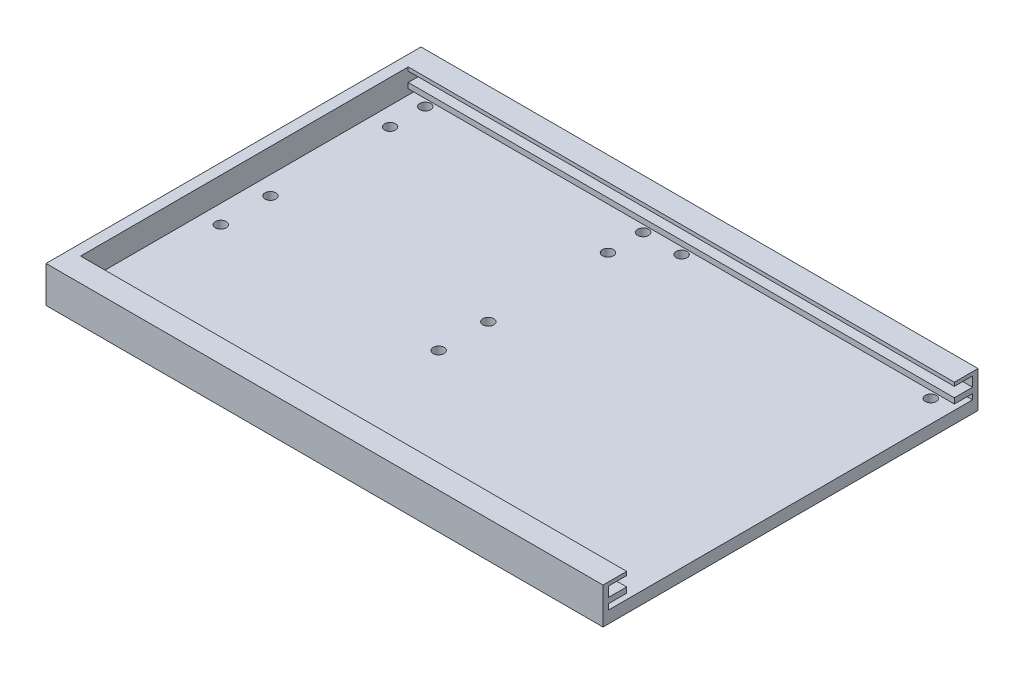
ISO-10303-21;
HEADER;
FILE_DESCRIPTION(('STEP AP214'),'2;1');
FILE_NAME('part.step','',(''),(''),'','','');
FILE_SCHEMA(('AUTOMOTIVE_DESIGN { 1 0 10303 214 1 1 1 1 }'));
ENDSEC;
DATA;
#1=APPLICATION_CONTEXT('core data for automotive mechanical design processes');
#2=APPLICATION_PROTOCOL_DEFINITION('international standard','automotive_design',2000,#1);
#3=PRODUCT_CONTEXT('',#1,'mechanical');
#4=PRODUCT('Part','Part','',(#3));
#5=PRODUCT_RELATED_PRODUCT_CATEGORY('part','',(#4));
#6=PRODUCT_DEFINITION_FORMATION('','',#4);
#7=PRODUCT_DEFINITION_CONTEXT('part definition',#1,'design');
#8=PRODUCT_DEFINITION('design','',#6,#7);
#9=PRODUCT_DEFINITION_SHAPE('','',#8);
#10=(LENGTH_UNIT() NAMED_UNIT(*) SI_UNIT(.MILLI.,.METRE.));
#11=(NAMED_UNIT(*) PLANE_ANGLE_UNIT() SI_UNIT($,.RADIAN.));
#12=(NAMED_UNIT(*) SI_UNIT($,.STERADIAN.) SOLID_ANGLE_UNIT());
#13=UNCERTAINTY_MEASURE_WITH_UNIT(LENGTH_MEASURE(1.E-05),#10,'distance_accuracy_value','');
#14=(GEOMETRIC_REPRESENTATION_CONTEXT(3) GLOBAL_UNCERTAINTY_ASSIGNED_CONTEXT((#13)) GLOBAL_UNIT_ASSIGNED_CONTEXT((#10,
#11,#12)) REPRESENTATION_CONTEXT('',''));
#15=CARTESIAN_POINT('',(0.,0.,0.));
#16=DIRECTION('',(0.,0.,1.));
#17=DIRECTION('',(1.,0.,0.));
#18=AXIS2_PLACEMENT_3D('',#15,#16,#17);
#19=CARTESIAN_POINT('',(3.,1.30000000000001,50.));
#20=DIRECTION('',(0.,-1.,0.));
#21=DIRECTION('',(0.,0.,-1.));
#22=AXIS2_PLACEMENT_3D('',#19,#20,#21);
#23=PLANE('',#22);
#24=DIRECTION('',(0.,0.,-1.));
#25=VECTOR('',#24,1.);
#26=CARTESIAN_POINT('',(3.,1.30000000000001,50.));
#27=LINE('',#26,#25);
#28=CARTESIAN_POINT('',(3.,1.30000000000001,-45.));
#29=VERTEX_POINT('',#28);
#30=CARTESIAN_POINT('',(3.,1.30000000000001,-50.));
#31=VERTEX_POINT('',#30);
#32=EDGE_CURVE('E247',#29,#31,#27,.T.);
#33=ORIENTED_EDGE('',*,*,#32,.F.);
#34=DIRECTION('',(1.,0.,0.));
#35=VECTOR('',#34,1.);
#36=CARTESIAN_POINT('',(3.,1.30000000000002,-45.));
#37=LINE('',#36,#35);
#38=CARTESIAN_POINT('',(153.,1.30000000000002,-45.));
#39=VERTEX_POINT('',#38);
#40=EDGE_CURVE('E231',#29,#39,#37,.T.);
#41=ORIENTED_EDGE('',*,*,#40,.T.);
#42=DIRECTION('',(0.,0.,-1.));
#43=VECTOR('',#42,1.);
#44=CARTESIAN_POINT('',(153.,1.30000000000001,50.));
#45=LINE('',#44,#43);
#46=CARTESIAN_POINT('',(153.,1.30000000000001,-50.));
#47=VERTEX_POINT('',#46);
#48=EDGE_CURVE('E259',#39,#47,#45,.T.);
#49=ORIENTED_EDGE('',*,*,#48,.T.);
#50=DIRECTION('',(1.,0.,0.));
#51=VECTOR('',#50,1.);
#52=CARTESIAN_POINT('',(3.,1.30000000000001,-50.));
#53=LINE('',#52,#51);
#54=EDGE_CURVE('E269',#31,#47,#53,.T.);
#55=ORIENTED_EDGE('',*,*,#54,.F.);
#56=EDGE_LOOP('',(#33,#41,#49,#55));
#57=FACE_BOUND('',#56,.T.);
#58=ADVANCED_FACE('F35',(#57),#23,.F.);
#59=CARTESIAN_POINT('',(153.,5.,-51.5));
#60=DIRECTION('',(0.,0.,1.));
#61=DIRECTION('',(1.,0.,0.));
#62=AXIS2_PLACEMENT_3D('',#59,#60,#61);
#63=PLANE('',#62);
#64=DIRECTION('',(0.,1.,0.));
#65=VECTOR('',#64,1.);
#66=CARTESIAN_POINT('',(0.,5.,-51.5));
#67=LINE('',#66,#65);
#68=CARTESIAN_POINT('',(0.,-5.,-51.5));
#69=VERTEX_POINT('',#68);
#70=CARTESIAN_POINT('',(0.,5.,-51.5));
#71=VERTEX_POINT('',#70);
#72=EDGE_CURVE('E290',#69,#71,#67,.T.);
#73=ORIENTED_EDGE('',*,*,#72,.T.);
#74=DIRECTION('',(-1.,0.,0.));
#75=VECTOR('',#74,1.);
#76=CARTESIAN_POINT('',(153.,5.,-51.5));
#77=LINE('',#76,#75);
#78=CARTESIAN_POINT('',(153.,5.,-51.5));
#79=VERTEX_POINT('',#78);
#80=EDGE_CURVE('E11',#79,#71,#77,.T.);
#81=ORIENTED_EDGE('',*,*,#80,.F.);
#82=DIRECTION('',(0.,1.,0.));
#83=VECTOR('',#82,1.);
#84=CARTESIAN_POINT('',(153.,5.,-51.5));
#85=LINE('',#84,#83);
#86=CARTESIAN_POINT('',(153.,-5.,-51.5));
#87=VERTEX_POINT('',#86);
#88=EDGE_CURVE('E297',#87,#79,#85,.T.);
#89=ORIENTED_EDGE('',*,*,#88,.F.);
#90=DIRECTION('',(-1.,0.,0.));
#91=VECTOR('',#90,1.);
#92=CARTESIAN_POINT('',(153.,-5.,-51.5));
#93=LINE('',#92,#91);
#94=EDGE_CURVE('E309',#87,#69,#93,.T.);
#95=ORIENTED_EDGE('',*,*,#94,.T.);
#96=EDGE_LOOP('',(#73,#81,#89,#95));
#97=FACE_BOUND('',#96,.T.);
#98=ADVANCED_FACE('F37',(#97),#63,.F.);
#99=CARTESIAN_POINT('',(153.,5.,51.5));
#100=DIRECTION('',(0.,-1.,0.));
#101=DIRECTION('',(0.,0.,-1.));
#102=AXIS2_PLACEMENT_3D('',#99,#100,#101);
#103=PLANE('',#102);
#104=DIRECTION('',(0.,0.,1.));
#105=VECTOR('',#104,1.);
#106=CARTESIAN_POINT('',(3.,5.00000000000002,-45.));
#107=LINE('',#106,#105);
#108=CARTESIAN_POINT('',(3.,5.00000000000002,-45.));
#109=VERTEX_POINT('',#108);
#110=CARTESIAN_POINT('',(3.,5.,45.));
#111=VERTEX_POINT('',#110);
#112=EDGE_CURVE('E276',#109,#111,#107,.T.);
#113=ORIENTED_EDGE('',*,*,#112,.F.);
#114=DIRECTION('',(1.,0.,0.));
#115=VECTOR('',#114,1.);
#116=CARTESIAN_POINT('',(3.,5.00000000000002,-45.));
#117=LINE('',#116,#115);
#118=CARTESIAN_POINT('',(153.,5.00000000000002,-45.));
#119=VERTEX_POINT('',#118);
#120=EDGE_CURVE('E287',#109,#119,#117,.T.);
#121=ORIENTED_EDGE('',*,*,#120,.T.);
#122=DIRECTION('',(0.,0.,1.));
#123=VECTOR('',#122,1.);
#124=CARTESIAN_POINT('',(153.,5.,51.5));
#125=LINE('',#124,#123);
#126=EDGE_CURVE('E302',#79,#119,#125,.T.);
#127=ORIENTED_EDGE('',*,*,#126,.F.);
#128=ORIENTED_EDGE('',*,*,#80,.T.);
#129=DIRECTION('',(0.,0.,1.));
#130=VECTOR('',#129,1.);
#131=CARTESIAN_POINT('',(0.,5.,51.5));
#132=LINE('',#131,#130);
#133=CARTESIAN_POINT('',(0.,5.,51.5));
#134=VERTEX_POINT('',#133);
#135=EDGE_CURVE('E312',#71,#134,#132,.T.);
#136=ORIENTED_EDGE('',*,*,#135,.T.);
#137=DIRECTION('',(-1.,0.,0.));
#138=VECTOR('',#137,1.);
#139=CARTESIAN_POINT('',(153.,5.,51.5));
#140=LINE('',#139,#138);
#141=CARTESIAN_POINT('',(153.,5.,51.5));
#142=VERTEX_POINT('',#141);
#143=EDGE_CURVE('E44',#142,#134,#140,.T.);
#144=ORIENTED_EDGE('',*,*,#143,.F.);
#145=CARTESIAN_POINT('',(153.,5.,45.));
#146=VERTEX_POINT('',#145);
#147=EDGE_CURVE('E300',#146,#142,#125,.T.);
#148=ORIENTED_EDGE('',*,*,#147,.F.);
#149=DIRECTION('',(1.,0.,0.));
#150=VECTOR('',#149,1.);
#151=CARTESIAN_POINT('',(3.,5.,45.));
#152=LINE('',#151,#150);
#153=EDGE_CURVE('E60',#111,#146,#152,.T.);
#154=ORIENTED_EDGE('',*,*,#153,.F.);
#155=EDGE_LOOP('',(#113,#121,#127,#128,#136,#144,#148,#154));
#156=FACE_BOUND('',#155,.T.);
#157=ADVANCED_FACE('F412',(#156),#103,.F.);
#158=CARTESIAN_POINT('',(153.,5.,51.5));
#159=DIRECTION('',(0.,0.,-1.));
#160=DIRECTION('',(-1.,0.,0.));
#161=AXIS2_PLACEMENT_3D('',#158,#159,#160);
#162=PLANE('',#161);
#163=DIRECTION('',(0.,-1.,0.));
#164=VECTOR('',#163,1.);
#165=CARTESIAN_POINT('',(0.,5.,51.5));
#166=LINE('',#165,#164);
#167=CARTESIAN_POINT('',(0.,-5.,51.5));
#168=VERTEX_POINT('',#167);
#169=EDGE_CURVE('E314',#134,#168,#166,.T.);
#170=ORIENTED_EDGE('',*,*,#169,.T.);
#171=DIRECTION('',(-1.,0.,0.));
#172=VECTOR('',#171,1.);
#173=CARTESIAN_POINT('',(153.,-5.,51.5));
#174=LINE('',#173,#172);
#175=CARTESIAN_POINT('',(153.,-5.,51.5));
#176=VERTEX_POINT('',#175);
#177=EDGE_CURVE('E319',#176,#168,#174,.T.);
#178=ORIENTED_EDGE('',*,*,#177,.F.);
#179=DIRECTION('',(0.,-1.,0.));
#180=VECTOR('',#179,1.);
#181=CARTESIAN_POINT('',(153.,5.,51.5));
#182=LINE('',#181,#180);
#183=EDGE_CURVE('E305',#142,#176,#182,.T.);
#184=ORIENTED_EDGE('',*,*,#183,.F.);
#185=ORIENTED_EDGE('',*,*,#143,.T.);
#186=EDGE_LOOP('',(#170,#178,#184,#185));
#187=FACE_BOUND('',#186,.T.);
#188=ADVANCED_FACE('F395',(#187),#162,.F.);
#189=CARTESIAN_POINT('',(153.,-5.,51.5));
#190=DIRECTION('',(0.,1.,0.));
#191=DIRECTION('',(0.,0.,1.));
#192=AXIS2_PLACEMENT_3D('',#189,#190,#191);
#193=PLANE('',#192);
#194=CARTESIAN_POINT('',(8.07500000000001,-5.,11.575));
#195=DIRECTION('',(0.,-1.,0.));
#196=DIRECTION('',(0.,0.,-1.));
#197=AXIS2_PLACEMENT_3D('',#194,#195,#196);
#198=CIRCLE('',#197,1.5);
#199=CARTESIAN_POINT('',(8.07500000000001,-5.,10.075));
#200=VERTEX_POINT('',#199);
#201=EDGE_CURVE('E601',#200,#200,#198,.T.);
#202=ORIENTED_EDGE('',*,*,#201,.F.);
#203=EDGE_LOOP('',(#202));
#204=FACE_BOUND('',#203,.T.);
#205=CARTESIAN_POINT('',(8.075,-5.,-34.925));
#206=DIRECTION('',(0.,-1.,0.));
#207=DIRECTION('',(0.,0.,-1.));
#208=AXIS2_PLACEMENT_3D('',#205,#206,#207);
#209=CIRCLE('',#208,1.5);
#210=CARTESIAN_POINT('',(8.075,-5.,-36.425));
#211=VERTEX_POINT('',#210);
#212=EDGE_CURVE('E597',#211,#211,#209,.T.);
#213=ORIENTED_EDGE('',*,*,#212,.F.);
#214=EDGE_LOOP('',(#213));
#215=FACE_BOUND('',#214,.T.);
#216=CARTESIAN_POINT('',(67.925,-5.,-34.925));
#217=DIRECTION('',(0.,-1.,0.));
#218=DIRECTION('',(0.,0.,-1.));
#219=AXIS2_PLACEMENT_3D('',#216,#217,#218);
#220=CIRCLE('',#219,1.5);
#221=CARTESIAN_POINT('',(67.925,-5.,-36.425));
#222=VERTEX_POINT('',#221);
#223=EDGE_CURVE('E561',#222,#222,#220,.T.);
#224=ORIENTED_EDGE('',*,*,#223,.F.);
#225=EDGE_LOOP('',(#224));
#226=FACE_BOUND('',#225,.T.);
#227=CARTESIAN_POINT('',(67.925,-5.,-44.6022081712717));
#228=DIRECTION('',(0.,-1.,0.));
#229=DIRECTION('',(0.,0.,-1.));
#230=AXIS2_PLACEMENT_3D('',#227,#228,#229);
#231=CIRCLE('',#230,1.5);
#232=CARTESIAN_POINT('',(67.925,-5.,-46.1022081712717));
#233=VERTEX_POINT('',#232);
#234=EDGE_CURVE('E598',#233,#233,#231,.T.);
#235=ORIENTED_EDGE('',*,*,#234,.F.);
#236=EDGE_LOOP('',(#235));
#237=FACE_BOUND('',#236,.T.);
#238=CARTESIAN_POINT('',(8.075,-5.,-44.6022081712717));
#239=DIRECTION('',(0.,-1.,0.));
#240=DIRECTION('',(0.,0.,-1.));
#241=AXIS2_PLACEMENT_3D('',#238,#239,#240);
#242=CIRCLE('',#241,1.5);
#243=CARTESIAN_POINT('',(8.075,-5.,-46.1022081712717));
#244=VERTEX_POINT('',#243);
#245=EDGE_CURVE('E604',#244,#244,#242,.T.);
#246=ORIENTED_EDGE('',*,*,#245,.F.);
#247=EDGE_LOOP('',(#246));
#248=FACE_BOUND('',#247,.T.);
#249=CARTESIAN_POINT('',(67.925,-5.,44.425));
#250=DIRECTION('',(0.,-1.,0.));
#251=DIRECTION('',(0.,0.,-1.));
#252=AXIS2_PLACEMENT_3D('',#249,#250,#251);
#253=CIRCLE('',#252,1.5);
#254=CARTESIAN_POINT('',(67.925,-5.,42.925));
#255=VERTEX_POINT('',#254);
#256=EDGE_CURVE('E347',#255,#255,#253,.T.);
#257=ORIENTED_EDGE('',*,*,#256,.F.);
#258=EDGE_LOOP('',(#257));
#259=FACE_BOUND('',#258,.T.);
#260=CARTESIAN_POINT('',(8.075,-5.,-2.07499999999999));
#261=DIRECTION('',(0.,-1.,0.));
#262=DIRECTION('',(0.,0.,-1.));
#263=AXIS2_PLACEMENT_3D('',#260,#261,#262);
#264=CIRCLE('',#263,1.5);
#265=CARTESIAN_POINT('',(8.075,-5.,-3.57499999999999));
#266=VERTEX_POINT('',#265);
#267=EDGE_CURVE('E377',#266,#266,#264,.T.);
#268=ORIENTED_EDGE('',*,*,#267,.F.);
#269=EDGE_LOOP('',(#268));
#270=FACE_BOUND('',#269,.T.);
#271=CARTESIAN_POINT('',(67.925,-5.,-2.07499999999999));
#272=DIRECTION('',(0.,-1.,0.));
#273=DIRECTION('',(0.,0.,-1.));
#274=AXIS2_PLACEMENT_3D('',#271,#272,#273);
#275=CIRCLE('',#274,1.5);
#276=CARTESIAN_POINT('',(67.925,-5.,-3.57499999999999));
#277=VERTEX_POINT('',#276);
#278=EDGE_CURVE('E612',#277,#277,#275,.T.);
#279=ORIENTED_EDGE('',*,*,#278,.F.);
#280=EDGE_LOOP('',(#279));
#281=FACE_BOUND('',#280,.T.);
#282=CARTESIAN_POINT('',(67.925,-5.,11.575));
#283=DIRECTION('',(0.,-1.,0.));
#284=DIRECTION('',(0.,0.,-1.));
#285=AXIS2_PLACEMENT_3D('',#282,#283,#284);
#286=CIRCLE('',#285,1.5);
#287=CARTESIAN_POINT('',(67.925,-5.,10.075));
#288=VERTEX_POINT('',#287);
#289=EDGE_CURVE('E610',#288,#288,#286,.T.);
#290=ORIENTED_EDGE('',*,*,#289,.F.);
#291=EDGE_LOOP('',(#290));
#292=FACE_BOUND('',#291,.T.);
#293=CARTESIAN_POINT('',(8.075,-5.,44.425));
#294=DIRECTION('',(0.,-1.,0.));
#295=DIRECTION('',(0.,0.,-1.));
#296=AXIS2_PLACEMENT_3D('',#293,#294,#295);
#297=CIRCLE('',#296,1.5);
#298=CARTESIAN_POINT('',(8.075,-5.,42.925));
#299=VERTEX_POINT('',#298);
#300=EDGE_CURVE('E342',#299,#299,#297,.T.);
#301=ORIENTED_EDGE('',*,*,#300,.F.);
#302=EDGE_LOOP('',(#301));
#303=FACE_BOUND('',#302,.T.);
#304=CARTESIAN_POINT('',(146.925,-5.,44.4277918287283));
#305=DIRECTION('',(0.,-1.,0.));
#306=DIRECTION('',(0.,0.,-1.));
#307=AXIS2_PLACEMENT_3D('',#304,#305,#306);
#308=CIRCLE('',#307,1.5);
#309=CARTESIAN_POINT('',(146.925,-5.,42.9277918287283));
#310=VERTEX_POINT('',#309);
#311=EDGE_CURVE('E332',#310,#310,#308,.T.);
#312=ORIENTED_EDGE('',*,*,#311,.F.);
#313=EDGE_LOOP('',(#312));
#314=FACE_BOUND('',#313,.T.);
#315=CARTESIAN_POINT('',(78.475,-5.,-44.6022081712717));
#316=DIRECTION('',(0.,-1.,0.));
#317=DIRECTION('',(0.,0.,-1.));
#318=AXIS2_PLACEMENT_3D('',#315,#316,#317);
#319=CIRCLE('',#318,1.5);
#320=CARTESIAN_POINT('',(78.475,-5.,-46.1022081712717));
#321=VERTEX_POINT('',#320);
#322=EDGE_CURVE('E381',#321,#321,#319,.T.);
#323=ORIENTED_EDGE('',*,*,#322,.F.);
#324=EDGE_LOOP('',(#323));
#325=FACE_BOUND('',#324,.T.);
#326=CARTESIAN_POINT('',(146.925,-5.,-44.6022081712717));
#327=DIRECTION('',(0.,-1.,0.));
#328=DIRECTION('',(0.,0.,-1.));
#329=AXIS2_PLACEMENT_3D('',#326,#327,#328);
#330=CIRCLE('',#329,1.5);
#331=CARTESIAN_POINT('',(146.925,-5.,-46.1022081712717));
#332=VERTEX_POINT('',#331);
#333=EDGE_CURVE('E341',#332,#332,#330,.T.);
#334=ORIENTED_EDGE('',*,*,#333,.F.);
#335=EDGE_LOOP('',(#334));
#336=FACE_BOUND('',#335,.T.);
#337=CARTESIAN_POINT('',(78.475,-5.,44.4277918287283));
#338=DIRECTION('',(0.,-1.,0.));
#339=DIRECTION('',(0.,0.,-1.));
#340=AXIS2_PLACEMENT_3D('',#337,#338,#339);
#341=CIRCLE('',#340,1.5);
#342=CARTESIAN_POINT('',(78.475,-5.,42.9277918287283));
#343=VERTEX_POINT('',#342);
#344=EDGE_CURVE('E327',#343,#343,#341,.T.);
#345=ORIENTED_EDGE('',*,*,#344,.F.);
#346=EDGE_LOOP('',(#345));
#347=FACE_BOUND('',#346,.T.);
#348=DIRECTION('',(0.,0.,-1.));
#349=VECTOR('',#348,1.);
#350=CARTESIAN_POINT('',(0.,-5.,51.5));
#351=LINE('',#350,#349);
#352=EDGE_CURVE('E301',#168,#69,#351,.T.);
#353=ORIENTED_EDGE('',*,*,#352,.T.);
#354=ORIENTED_EDGE('',*,*,#94,.F.);
#355=DIRECTION('',(0.,0.,-1.));
#356=VECTOR('',#355,1.);
#357=CARTESIAN_POINT('',(153.,-5.,51.5));
#358=LINE('',#357,#356);
#359=EDGE_CURVE('E307',#176,#87,#358,.T.);
#360=ORIENTED_EDGE('',*,*,#359,.F.);
#361=ORIENTED_EDGE('',*,*,#177,.T.);
#362=EDGE_LOOP('',(#353,#354,#360,#361));
#363=FACE_BOUND('',#362,.T.);
#364=ADVANCED_FACE('F391',(#204,#215,#226,#237,#248,#259,#270,#281,#292,#303,#314,#325,#336,
#347,#363),#193,.F.);
#365=CARTESIAN_POINT('',(153.,0.,0.));
#366=DIRECTION('',(1.,0.,0.));
#367=DIRECTION('',(0.,0.,-1.));
#368=AXIS2_PLACEMENT_3D('',#365,#366,#367);
#369=PLANE('',#368);
#370=DIRECTION('',(0.,0.,1.));
#371=VECTOR('',#370,1.);
#372=CARTESIAN_POINT('',(153.,-0.199999999999986,0.));
#373=LINE('',#372,#371);
#374=CARTESIAN_POINT('',(153.,-0.19999999999998,-50.));
#375=VERTEX_POINT('',#374);
#376=CARTESIAN_POINT('',(153.,-0.199999999999983,-45.));
#377=VERTEX_POINT('',#376);
#378=EDGE_CURVE('E209',#375,#377,#373,.T.);
#379=ORIENTED_EDGE('',*,*,#378,.F.);
#380=DIRECTION('',(0.,1.,0.));
#381=VECTOR('',#380,1.);
#382=CARTESIAN_POINT('',(153.,-1.69999999999998,-50.));
#383=LINE('',#382,#381);
#384=CARTESIAN_POINT('',(153.,-1.69999999999998,-50.));
#385=VERTEX_POINT('',#384);
#386=EDGE_CURVE('E187',#385,#375,#383,.T.);
#387=ORIENTED_EDGE('',*,*,#386,.F.);
#388=DIRECTION('',(0.,0.,-1.));
#389=VECTOR('',#388,1.);
#390=CARTESIAN_POINT('',(153.,-1.69999999999998,50.));
#391=LINE('',#390,#389);
#392=CARTESIAN_POINT('',(153.,-1.69999999999998,50.));
#393=VERTEX_POINT('',#392);
#394=EDGE_CURVE('E213',#393,#385,#391,.T.);
#395=ORIENTED_EDGE('',*,*,#394,.F.);
#396=DIRECTION('',(0.,-1.,0.));
#397=VECTOR('',#396,1.);
#398=CARTESIAN_POINT('',(153.,-0.199999999999989,50.));
#399=LINE('',#398,#397);
#400=CARTESIAN_POINT('',(153.,-0.199999999999989,50.));
#401=VERTEX_POINT('',#400);
#402=EDGE_CURVE('E211',#401,#393,#399,.T.);
#403=ORIENTED_EDGE('',*,*,#402,.F.);
#404=CARTESIAN_POINT('',(153.,-0.199999999999989,45.));
#405=VERTEX_POINT('',#404);
#406=EDGE_CURVE('E193',#405,#401,#373,.T.);
#407=ORIENTED_EDGE('',*,*,#406,.F.);
#408=DIRECTION('',(0.,-1.,0.));
#409=VECTOR('',#408,1.);
#410=CARTESIAN_POINT('',(153.,1.30000000000001,45.));
#411=LINE('',#410,#409);
#412=CARTESIAN_POINT('',(153.,1.30000000000001,45.));
#413=VERTEX_POINT('',#412);
#414=EDGE_CURVE('E220',#413,#405,#411,.T.);
#415=ORIENTED_EDGE('',*,*,#414,.F.);
#416=CARTESIAN_POINT('',(153.,1.30000000000001,50.));
#417=VERTEX_POINT('',#416);
#418=EDGE_CURVE('E260',#417,#413,#45,.T.);
#419=ORIENTED_EDGE('',*,*,#418,.F.);
#420=DIRECTION('',(0.,-1.,0.));
#421=VECTOR('',#420,1.);
#422=CARTESIAN_POINT('',(153.,4.00000000000001,50.));
#423=LINE('',#422,#421);
#424=CARTESIAN_POINT('',(153.,4.00000000000001,50.));
#425=VERTEX_POINT('',#424);
#426=EDGE_CURVE('E256',#425,#417,#423,.T.);
#427=ORIENTED_EDGE('',*,*,#426,.F.);
#428=DIRECTION('',(0.,0.,1.));
#429=VECTOR('',#428,1.);
#430=CARTESIAN_POINT('',(153.,4.00000000000001,0.));
#431=LINE('',#430,#429);
#432=CARTESIAN_POINT('',(153.,4.00000000000001,45.));
#433=VERTEX_POINT('',#432);
#434=EDGE_CURVE('E234',#433,#425,#431,.T.);
#435=ORIENTED_EDGE('',*,*,#434,.F.);
#436=DIRECTION('',(0.,-1.,0.));
#437=VECTOR('',#436,1.);
#438=CARTESIAN_POINT('',(153.,5.,45.));
#439=LINE('',#438,#437);
#440=EDGE_CURVE('E268',#146,#433,#439,.T.);
#441=ORIENTED_EDGE('',*,*,#440,.F.);
#442=ORIENTED_EDGE('',*,*,#147,.T.);
#443=ORIENTED_EDGE('',*,*,#183,.T.);
#444=ORIENTED_EDGE('',*,*,#359,.T.);
#445=ORIENTED_EDGE('',*,*,#88,.T.);
#446=ORIENTED_EDGE('',*,*,#126,.T.);
#447=DIRECTION('',(0.,1.,0.));
#448=VECTOR('',#447,1.);
#449=CARTESIAN_POINT('',(153.,4.00000000000001,-45.));
#450=LINE('',#449,#448);
#451=CARTESIAN_POINT('',(153.,4.00000000000001,-45.));
#452=VERTEX_POINT('',#451);
#453=EDGE_CURVE('E279',#452,#119,#450,.T.);
#454=ORIENTED_EDGE('',*,*,#453,.F.);
#455=CARTESIAN_POINT('',(153.,4.00000000000002,-50.));
#456=VERTEX_POINT('',#455);
#457=EDGE_CURVE('E254',#456,#452,#431,.T.);
#458=ORIENTED_EDGE('',*,*,#457,.F.);
#459=DIRECTION('',(0.,1.,0.));
#460=VECTOR('',#459,1.);
#461=CARTESIAN_POINT('',(153.,1.30000000000001,-50.));
#462=LINE('',#461,#460);
#463=EDGE_CURVE('E263',#47,#456,#462,.T.);
#464=ORIENTED_EDGE('',*,*,#463,.F.);
#465=ORIENTED_EDGE('',*,*,#48,.F.);
#466=DIRECTION('',(0.,1.,0.));
#467=VECTOR('',#466,1.);
#468=CARTESIAN_POINT('',(153.,-0.199999999999986,-45.));
#469=LINE('',#468,#467);
#470=EDGE_CURVE('E225',#377,#39,#469,.T.);
#471=ORIENTED_EDGE('',*,*,#470,.F.);
#472=EDGE_LOOP('',(#379,#387,#395,#403,#407,#415,#419,#427,#435,#441,#442,#443,#444,#445,#446,
#454,#458,#464,#465,#471));
#473=FACE_BOUND('',#472,.T.);
#474=ADVANCED_FACE('F394',(#473),#369,.T.);
#475=CARTESIAN_POINT('',(0.,0.,0.));
#476=DIRECTION('',(1.,0.,0.));
#477=DIRECTION('',(0.,0.,-1.));
#478=AXIS2_PLACEMENT_3D('',#475,#476,#477);
#479=PLANE('',#478);
#480=ORIENTED_EDGE('',*,*,#72,.F.);
#481=ORIENTED_EDGE('',*,*,#352,.F.);
#482=ORIENTED_EDGE('',*,*,#169,.F.);
#483=ORIENTED_EDGE('',*,*,#135,.F.);
#484=EDGE_LOOP('',(#480,#481,#482,#483));
#485=FACE_BOUND('',#484,.T.);
#486=ADVANCED_FACE('F408',(#485),#479,.F.);
#487=CARTESIAN_POINT('',(3.,4.00000000000001,-45.));
#488=DIRECTION('',(0.,0.,-1.));
#489=DIRECTION('',(-1.,0.,0.));
#490=AXIS2_PLACEMENT_3D('',#487,#488,#489);
#491=PLANE('',#490);
#492=ORIENTED_EDGE('',*,*,#453,.T.);
#493=ORIENTED_EDGE('',*,*,#120,.F.);
#494=DIRECTION('',(0.,1.,0.));
#495=VECTOR('',#494,1.);
#496=CARTESIAN_POINT('',(3.,4.00000000000001,-45.));
#497=LINE('',#496,#495);
#498=CARTESIAN_POINT('',(3.,4.00000000000001,-45.));
#499=VERTEX_POINT('',#498);
#500=EDGE_CURVE('E282',#499,#109,#497,.T.);
#501=ORIENTED_EDGE('',*,*,#500,.F.);
#502=DIRECTION('',(1.,0.,0.));
#503=VECTOR('',#502,1.);
#504=CARTESIAN_POINT('',(3.,4.00000000000001,-45.));
#505=LINE('',#504,#503);
#506=EDGE_CURVE('E291',#499,#452,#505,.T.);
#507=ORIENTED_EDGE('',*,*,#506,.T.);
#508=EDGE_LOOP('',(#492,#493,#501,#507));
#509=FACE_BOUND('',#508,.T.);
#510=ADVANCED_FACE('F465',(#509),#491,.F.);
#511=CARTESIAN_POINT('',(3.,5.,45.));
#512=DIRECTION('',(0.,0.,1.));
#513=DIRECTION('',(1.,0.,0.));
#514=AXIS2_PLACEMENT_3D('',#511,#512,#513);
#515=PLANE('',#514);
#516=ORIENTED_EDGE('',*,*,#440,.T.);
#517=DIRECTION('',(1.,0.,0.));
#518=VECTOR('',#517,1.);
#519=CARTESIAN_POINT('',(3.,4.00000000000001,45.));
#520=LINE('',#519,#518);
#521=CARTESIAN_POINT('',(3.,4.,45.));
#522=VERTEX_POINT('',#521);
#523=EDGE_CURVE('E294',#522,#433,#520,.T.);
#524=ORIENTED_EDGE('',*,*,#523,.F.);
#525=DIRECTION('',(0.,-1.,0.));
#526=VECTOR('',#525,1.);
#527=CARTESIAN_POINT('',(3.,5.,45.));
#528=LINE('',#527,#526);
#529=EDGE_CURVE('E278',#111,#522,#528,.T.);
#530=ORIENTED_EDGE('',*,*,#529,.F.);
#531=ORIENTED_EDGE('',*,*,#153,.T.);
#532=EDGE_LOOP('',(#516,#524,#530,#531));
#533=FACE_BOUND('',#532,.T.);
#534=ADVANCED_FACE('F421',(#533),#515,.F.);
#535=CARTESIAN_POINT('',(3.,0.,0.));
#536=DIRECTION('',(1.,0.,0.));
#537=DIRECTION('',(0.,0.,-1.));
#538=AXIS2_PLACEMENT_3D('',#535,#536,#537);
#539=PLANE('',#538);
#540=ORIENTED_EDGE('',*,*,#112,.T.);
#541=ORIENTED_EDGE('',*,*,#529,.T.);
#542=DIRECTION('',(0.,0.,1.));
#543=VECTOR('',#542,1.);
#544=CARTESIAN_POINT('',(3.,4.00000000000002,-50.));
#545=LINE('',#544,#543);
#546=CARTESIAN_POINT('',(3.,4.00000000000001,50.));
#547=VERTEX_POINT('',#546);
#548=EDGE_CURVE('E244',#522,#547,#545,.T.);
#549=ORIENTED_EDGE('',*,*,#548,.T.);
#550=DIRECTION('',(0.,-1.,0.));
#551=VECTOR('',#550,1.);
#552=CARTESIAN_POINT('',(3.,4.00000000000001,50.));
#553=LINE('',#552,#551);
#554=CARTESIAN_POINT('',(3.,1.30000000000001,50.));
#555=VERTEX_POINT('',#554);
#556=EDGE_CURVE('E243',#547,#555,#553,.T.);
#557=ORIENTED_EDGE('',*,*,#556,.T.);
#558=CARTESIAN_POINT('',(3.,1.30000000000001,45.));
#559=VERTEX_POINT('',#558);
#560=EDGE_CURVE('E248',#555,#559,#27,.T.);
#561=ORIENTED_EDGE('',*,*,#560,.T.);
#562=DIRECTION('',(0.,-1.,0.));
#563=VECTOR('',#562,1.);
#564=CARTESIAN_POINT('',(3.,1.30000000000001,45.));
#565=LINE('',#564,#563);
#566=CARTESIAN_POINT('',(3.,-0.199999999999986,45.));
#567=VERTEX_POINT('',#566);
#568=EDGE_CURVE('E183',#559,#567,#565,.T.);
#569=ORIENTED_EDGE('',*,*,#568,.T.);
#570=DIRECTION('',(0.,0.,1.));
#571=VECTOR('',#570,1.);
#572=CARTESIAN_POINT('',(3.,-0.19999999999998,-50.));
#573=LINE('',#572,#571);
#574=CARTESIAN_POINT('',(3.,-0.199999999999989,50.));
#575=VERTEX_POINT('',#574);
#576=EDGE_CURVE('E176',#567,#575,#573,.T.);
#577=ORIENTED_EDGE('',*,*,#576,.T.);
#578=DIRECTION('',(0.,-1.,0.));
#579=VECTOR('',#578,1.);
#580=CARTESIAN_POINT('',(3.,-0.199999999999989,50.));
#581=LINE('',#580,#579);
#582=CARTESIAN_POINT('',(3.,-1.69999999999998,50.));
#583=VERTEX_POINT('',#582);
#584=EDGE_CURVE('E181',#575,#583,#581,.T.);
#585=ORIENTED_EDGE('',*,*,#584,.T.);
#586=DIRECTION('',(0.,0.,-1.));
#587=VECTOR('',#586,1.);
#588=CARTESIAN_POINT('',(3.,-1.69999999999998,50.));
#589=LINE('',#588,#587);
#590=CARTESIAN_POINT('',(3.,-1.69999999999998,-50.));
#591=VERTEX_POINT('',#590);
#592=EDGE_CURVE('E202',#583,#591,#589,.T.);
#593=ORIENTED_EDGE('',*,*,#592,.T.);
#594=DIRECTION('',(0.,1.,0.));
#595=VECTOR('',#594,1.);
#596=CARTESIAN_POINT('',(3.,-1.69999999999998,-50.));
#597=LINE('',#596,#595);
#598=CARTESIAN_POINT('',(3.,-0.19999999999998,-50.));
#599=VERTEX_POINT('',#598);
#600=EDGE_CURVE('E198',#591,#599,#597,.T.);
#601=ORIENTED_EDGE('',*,*,#600,.T.);
#602=CARTESIAN_POINT('',(3.,-0.199999999999981,-45.));
#603=VERTEX_POINT('',#602);
#604=EDGE_CURVE('E186',#599,#603,#573,.T.);
#605=ORIENTED_EDGE('',*,*,#604,.T.);
#606=DIRECTION('',(0.,1.,0.));
#607=VECTOR('',#606,1.);
#608=CARTESIAN_POINT('',(3.,-0.199999999999986,-45.));
#609=LINE('',#608,#607);
#610=EDGE_CURVE('E52',#603,#29,#609,.T.);
#611=ORIENTED_EDGE('',*,*,#610,.T.);
#612=ORIENTED_EDGE('',*,*,#32,.T.);
#613=DIRECTION('',(0.,1.,0.));
#614=VECTOR('',#613,1.);
#615=CARTESIAN_POINT('',(3.,1.30000000000001,-50.));
#616=LINE('',#615,#614);
#617=CARTESIAN_POINT('',(3.,4.00000000000002,-50.));
#618=VERTEX_POINT('',#617);
#619=EDGE_CURVE('E250',#31,#618,#616,.T.);
#620=ORIENTED_EDGE('',*,*,#619,.T.);
#621=EDGE_CURVE('E241',#618,#499,#545,.T.);
#622=ORIENTED_EDGE('',*,*,#621,.T.);
#623=ORIENTED_EDGE('',*,*,#500,.T.);
#624=EDGE_LOOP('',(#540,#541,#549,#557,#561,#569,#577,#585,#593,#601,#605,#611,#612,#620,#622,#623));
#625=FACE_BOUND('',#624,.T.);
#626=ADVANCED_FACE('F178',(#625),#539,.T.);
#627=CARTESIAN_POINT('',(3.,4.00000000000001,0.));
#628=DIRECTION('',(0.,1.,0.));
#629=DIRECTION('',(0.,0.,1.));
#630=AXIS2_PLACEMENT_3D('',#627,#628,#629);
#631=PLANE('',#630);
#632=ORIENTED_EDGE('',*,*,#621,.F.);
#633=DIRECTION('',(1.,0.,0.));
#634=VECTOR('',#633,1.);
#635=CARTESIAN_POINT('',(3.,4.00000000000002,-50.));
#636=LINE('',#635,#634);
#637=EDGE_CURVE('E266',#618,#456,#636,.T.);
#638=ORIENTED_EDGE('',*,*,#637,.T.);
#639=ORIENTED_EDGE('',*,*,#457,.T.);
#640=ORIENTED_EDGE('',*,*,#506,.F.);
#641=EDGE_LOOP('',(#632,#638,#639,#640));
#642=FACE_BOUND('',#641,.T.);
#643=ADVANCED_FACE('F463',(#642),#631,.F.);
#644=ORIENTED_EDGE('',*,*,#434,.T.);
#645=DIRECTION('',(1.,0.,0.));
#646=VECTOR('',#645,1.);
#647=CARTESIAN_POINT('',(3.,4.00000000000001,50.));
#648=LINE('',#647,#646);
#649=EDGE_CURVE('E253',#547,#425,#648,.T.);
#650=ORIENTED_EDGE('',*,*,#649,.F.);
#651=ORIENTED_EDGE('',*,*,#548,.F.);
#652=ORIENTED_EDGE('',*,*,#523,.T.);
#653=EDGE_LOOP('',(#644,#650,#651,#652));
#654=FACE_BOUND('',#653,.T.);
#655=ADVANCED_FACE('F424',(#654),#631,.F.);
#656=CARTESIAN_POINT('',(3.,1.30000000000001,-50.));
#657=DIRECTION('',(0.,0.,-1.));
#658=DIRECTION('',(-1.,0.,0.));
#659=AXIS2_PLACEMENT_3D('',#656,#657,#658);
#660=PLANE('',#659);
#661=ORIENTED_EDGE('',*,*,#463,.T.);
#662=ORIENTED_EDGE('',*,*,#637,.F.);
#663=ORIENTED_EDGE('',*,*,#619,.F.);
#664=ORIENTED_EDGE('',*,*,#54,.T.);
#665=EDGE_LOOP('',(#661,#662,#663,#664));
#666=FACE_BOUND('',#665,.T.);
#667=ADVANCED_FACE('F459',(#666),#660,.F.);
#668=ORIENTED_EDGE('',*,*,#418,.T.);
#669=DIRECTION('',(1.,0.,0.));
#670=VECTOR('',#669,1.);
#671=CARTESIAN_POINT('',(3.,1.30000000000001,45.));
#672=LINE('',#671,#670);
#673=EDGE_CURVE('E227',#559,#413,#672,.T.);
#674=ORIENTED_EDGE('',*,*,#673,.F.);
#675=ORIENTED_EDGE('',*,*,#560,.F.);
#676=DIRECTION('',(1.,0.,0.));
#677=VECTOR('',#676,1.);
#678=CARTESIAN_POINT('',(3.,1.30000000000001,50.));
#679=LINE('',#678,#677);
#680=EDGE_CURVE('E272',#555,#417,#679,.T.);
#681=ORIENTED_EDGE('',*,*,#680,.T.);
#682=EDGE_LOOP('',(#668,#674,#675,#681));
#683=FACE_BOUND('',#682,.T.);
#684=ADVANCED_FACE('F435',(#683),#23,.F.);
#685=CARTESIAN_POINT('',(3.,4.00000000000001,50.));
#686=DIRECTION('',(0.,0.,1.));
#687=DIRECTION('',(1.,0.,0.));
#688=AXIS2_PLACEMENT_3D('',#685,#686,#687);
#689=PLANE('',#688);
#690=ORIENTED_EDGE('',*,*,#426,.T.);
#691=ORIENTED_EDGE('',*,*,#680,.F.);
#692=ORIENTED_EDGE('',*,*,#556,.F.);
#693=ORIENTED_EDGE('',*,*,#649,.T.);
#694=EDGE_LOOP('',(#690,#691,#692,#693));
#695=FACE_BOUND('',#694,.T.);
#696=ADVANCED_FACE('F430',(#695),#689,.F.);
#697=CARTESIAN_POINT('',(3.,-0.199999999999986,-45.));
#698=DIRECTION('',(0.,0.,-1.));
#699=DIRECTION('',(-1.,0.,0.));
#700=AXIS2_PLACEMENT_3D('',#697,#698,#699);
#701=PLANE('',#700);
#702=ORIENTED_EDGE('',*,*,#470,.T.);
#703=ORIENTED_EDGE('',*,*,#40,.F.);
#704=ORIENTED_EDGE('',*,*,#610,.F.);
#705=DIRECTION('',(1.,0.,0.));
#706=VECTOR('',#705,1.);
#707=CARTESIAN_POINT('',(3.,-0.199999999999986,-45.));
#708=LINE('',#707,#706);
#709=EDGE_CURVE('E235',#603,#377,#708,.T.);
#710=ORIENTED_EDGE('',*,*,#709,.T.);
#711=EDGE_LOOP('',(#702,#703,#704,#710));
#712=FACE_BOUND('',#711,.T.);
#713=ADVANCED_FACE('F449',(#712),#701,.F.);
#714=CARTESIAN_POINT('',(3.,1.30000000000001,45.));
#715=DIRECTION('',(0.,0.,1.));
#716=DIRECTION('',(1.,0.,0.));
#717=AXIS2_PLACEMENT_3D('',#714,#715,#716);
#718=PLANE('',#717);
#719=ORIENTED_EDGE('',*,*,#414,.T.);
#720=DIRECTION('',(1.,0.,0.));
#721=VECTOR('',#720,1.);
#722=CARTESIAN_POINT('',(3.,-0.199999999999986,45.));
#723=LINE('',#722,#721);
#724=EDGE_CURVE('E238',#567,#405,#723,.T.);
#725=ORIENTED_EDGE('',*,*,#724,.F.);
#726=ORIENTED_EDGE('',*,*,#568,.F.);
#727=ORIENTED_EDGE('',*,*,#673,.T.);
#728=EDGE_LOOP('',(#719,#725,#726,#727));
#729=FACE_BOUND('',#728,.T.);
#730=ADVANCED_FACE('F437',(#729),#718,.F.);
#731=CARTESIAN_POINT('',(3.,-0.199999999999986,0.));
#732=DIRECTION('',(0.,1.,0.));
#733=DIRECTION('',(0.,0.,1.));
#734=AXIS2_PLACEMENT_3D('',#731,#732,#733);
#735=PLANE('',#734);
#736=ORIENTED_EDGE('',*,*,#604,.F.);
#737=DIRECTION('',(1.,0.,0.));
#738=VECTOR('',#737,1.);
#739=CARTESIAN_POINT('',(3.,-0.19999999999998,-50.));
#740=LINE('',#739,#738);
#741=EDGE_CURVE('E218',#599,#375,#740,.T.);
#742=ORIENTED_EDGE('',*,*,#741,.T.);
#743=ORIENTED_EDGE('',*,*,#378,.T.);
#744=ORIENTED_EDGE('',*,*,#709,.F.);
#745=EDGE_LOOP('',(#736,#742,#743,#744));
#746=FACE_BOUND('',#745,.T.);
#747=ADVANCED_FACE('F447',(#746),#735,.F.);
#748=ORIENTED_EDGE('',*,*,#406,.T.);
#749=DIRECTION('',(1.,0.,0.));
#750=VECTOR('',#749,1.);
#751=CARTESIAN_POINT('',(3.,-0.199999999999989,50.));
#752=LINE('',#751,#750);
#753=EDGE_CURVE('E190',#575,#401,#752,.T.);
#754=ORIENTED_EDGE('',*,*,#753,.F.);
#755=ORIENTED_EDGE('',*,*,#576,.F.);
#756=ORIENTED_EDGE('',*,*,#724,.T.);
#757=EDGE_LOOP('',(#748,#754,#755,#756));
#758=FACE_BOUND('',#757,.T.);
#759=ADVANCED_FACE('F191',(#758),#735,.F.);
#760=CARTESIAN_POINT('',(3.,-1.69999999999998,-50.));
#761=DIRECTION('',(0.,0.,-1.));
#762=DIRECTION('',(-1.,0.,0.));
#763=AXIS2_PLACEMENT_3D('',#760,#761,#762);
#764=PLANE('',#763);
#765=ORIENTED_EDGE('',*,*,#386,.T.);
#766=ORIENTED_EDGE('',*,*,#741,.F.);
#767=ORIENTED_EDGE('',*,*,#600,.F.);
#768=DIRECTION('',(1.,0.,0.));
#769=VECTOR('',#768,1.);
#770=CARTESIAN_POINT('',(3.,-1.69999999999998,-50.));
#771=LINE('',#770,#769);
#772=EDGE_CURVE('E221',#591,#385,#771,.T.);
#773=ORIENTED_EDGE('',*,*,#772,.T.);
#774=EDGE_LOOP('',(#765,#766,#767,#773));
#775=FACE_BOUND('',#774,.T.);
#776=ADVANCED_FACE('F444',(#775),#764,.F.);
#777=CARTESIAN_POINT('',(3.,-1.69999999999998,50.));
#778=DIRECTION('',(0.,-1.,0.));
#779=DIRECTION('',(0.,0.,-1.));
#780=AXIS2_PLACEMENT_3D('',#777,#778,#779);
#781=PLANE('',#780);
#782=CARTESIAN_POINT('',(8.07500000000001,-1.69999999999998,11.575));
#783=DIRECTION('',(0.,-1.,0.));
#784=DIRECTION('',(0.,0.,-1.));
#785=AXIS2_PLACEMENT_3D('',#782,#783,#784);
#786=CIRCLE('',#785,1.5);
#787=CARTESIAN_POINT('',(8.07500000000001,-1.69999999999998,10.075));
#788=VERTEX_POINT('',#787);
#789=EDGE_CURVE('E39',#788,#788,#786,.T.);
#790=ORIENTED_EDGE('',*,*,#789,.T.);
#791=EDGE_LOOP('',(#790));
#792=FACE_BOUND('',#791,.T.);
#793=CARTESIAN_POINT('',(8.075,-1.69999999999998,-34.925));
#794=DIRECTION('',(0.,-1.,0.));
#795=DIRECTION('',(0.,0.,-1.));
#796=AXIS2_PLACEMENT_3D('',#793,#794,#795);
#797=CIRCLE('',#796,1.5);
#798=CARTESIAN_POINT('',(8.075,-1.69999999999998,-36.425));
#799=VERTEX_POINT('',#798);
#800=EDGE_CURVE('E364',#799,#799,#797,.T.);
#801=ORIENTED_EDGE('',*,*,#800,.T.);
#802=EDGE_LOOP('',(#801));
#803=FACE_BOUND('',#802,.T.);
#804=CARTESIAN_POINT('',(67.925,-1.69999999999998,-34.925));
#805=DIRECTION('',(0.,-1.,0.));
#806=DIRECTION('',(0.,0.,-1.));
#807=AXIS2_PLACEMENT_3D('',#804,#805,#806);
#808=CIRCLE('',#807,1.5);
#809=CARTESIAN_POINT('',(67.925,-1.69999999999998,-36.425));
#810=VERTEX_POINT('',#809);
#811=EDGE_CURVE('E362',#810,#810,#808,.T.);
#812=ORIENTED_EDGE('',*,*,#811,.T.);
#813=EDGE_LOOP('',(#812));
#814=FACE_BOUND('',#813,.T.);
#815=CARTESIAN_POINT('',(67.925,-1.69999999999998,-44.6022081712717));
#816=DIRECTION('',(0.,-1.,0.));
#817=DIRECTION('',(0.,0.,-1.));
#818=AXIS2_PLACEMENT_3D('',#815,#816,#817);
#819=CIRCLE('',#818,1.5);
#820=CARTESIAN_POINT('',(67.925,-1.69999999999998,-46.1022081712717));
#821=VERTEX_POINT('',#820);
#822=EDGE_CURVE('E359',#821,#821,#819,.T.);
#823=ORIENTED_EDGE('',*,*,#822,.T.);
#824=EDGE_LOOP('',(#823));
#825=FACE_BOUND('',#824,.T.);
#826=CARTESIAN_POINT('',(8.075,-1.69999999999998,-44.6022081712717));
#827=DIRECTION('',(0.,-1.,0.));
#828=DIRECTION('',(0.,0.,-1.));
#829=AXIS2_PLACEMENT_3D('',#826,#827,#828);
#830=CIRCLE('',#829,1.5);
#831=CARTESIAN_POINT('',(8.075,-1.69999999999998,-46.1022081712717));
#832=VERTEX_POINT('',#831);
#833=EDGE_CURVE('E356',#832,#832,#830,.T.);
#834=ORIENTED_EDGE('',*,*,#833,.T.);
#835=EDGE_LOOP('',(#834));
#836=FACE_BOUND('',#835,.T.);
#837=CARTESIAN_POINT('',(67.925,-1.69999999999998,44.425));
#838=DIRECTION('',(0.,-1.,0.));
#839=DIRECTION('',(0.,0.,-1.));
#840=AXIS2_PLACEMENT_3D('',#837,#838,#839);
#841=CIRCLE('',#840,1.5);
#842=CARTESIAN_POINT('',(67.925,-1.69999999999998,42.925));
#843=VERTEX_POINT('',#842);
#844=EDGE_CURVE('E353',#843,#843,#841,.T.);
#845=ORIENTED_EDGE('',*,*,#844,.T.);
#846=EDGE_LOOP('',(#845));
#847=FACE_BOUND('',#846,.T.);
#848=CARTESIAN_POINT('',(8.075,-1.69999999999998,-2.07499999999999));
#849=DIRECTION('',(0.,-1.,0.));
#850=DIRECTION('',(0.,0.,-1.));
#851=AXIS2_PLACEMENT_3D('',#848,#849,#850);
#852=CIRCLE('',#851,1.5);
#853=CARTESIAN_POINT('',(8.075,-1.69999999999998,-3.57499999999999));
#854=VERTEX_POINT('',#853);
#855=EDGE_CURVE('E350',#854,#854,#852,.T.);
#856=ORIENTED_EDGE('',*,*,#855,.T.);
#857=EDGE_LOOP('',(#856));
#858=FACE_BOUND('',#857,.T.);
#859=CARTESIAN_POINT('',(67.925,-1.69999999999998,-2.07499999999999));
#860=DIRECTION('',(0.,-1.,0.));
#861=DIRECTION('',(0.,0.,-1.));
#862=AXIS2_PLACEMENT_3D('',#859,#860,#861);
#863=CIRCLE('',#862,1.5);
#864=CARTESIAN_POINT('',(67.925,-1.69999999999998,-3.57499999999999));
#865=VERTEX_POINT('',#864);
#866=EDGE_CURVE('E346',#865,#865,#863,.T.);
#867=ORIENTED_EDGE('',*,*,#866,.T.);
#868=EDGE_LOOP('',(#867));
#869=FACE_BOUND('',#868,.T.);
#870=CARTESIAN_POINT('',(67.925,-1.69999999999998,11.575));
#871=DIRECTION('',(0.,-1.,0.));
#872=DIRECTION('',(0.,0.,-1.));
#873=AXIS2_PLACEMENT_3D('',#870,#871,#872);
#874=CIRCLE('',#873,1.5);
#875=CARTESIAN_POINT('',(67.925,-1.69999999999998,10.075));
#876=VERTEX_POINT('',#875);
#877=EDGE_CURVE('E343',#876,#876,#874,.T.);
#878=ORIENTED_EDGE('',*,*,#877,.T.);
#879=EDGE_LOOP('',(#878));
#880=FACE_BOUND('',#879,.T.);
#881=CARTESIAN_POINT('',(8.075,-1.69999999999998,44.425));
#882=DIRECTION('',(0.,-1.,0.));
#883=DIRECTION('',(0.,0.,-1.));
#884=AXIS2_PLACEMENT_3D('',#881,#882,#883);
#885=CIRCLE('',#884,1.5);
#886=CARTESIAN_POINT('',(8.075,-1.69999999999998,42.925));
#887=VERTEX_POINT('',#886);
#888=EDGE_CURVE('E338',#887,#887,#885,.T.);
#889=ORIENTED_EDGE('',*,*,#888,.T.);
#890=EDGE_LOOP('',(#889));
#891=FACE_BOUND('',#890,.T.);
#892=CARTESIAN_POINT('',(146.925,-1.69999999999998,44.4277918287283));
#893=DIRECTION('',(0.,-1.,0.));
#894=DIRECTION('',(0.,0.,-1.));
#895=AXIS2_PLACEMENT_3D('',#892,#893,#894);
#896=CIRCLE('',#895,1.5);
#897=CARTESIAN_POINT('',(146.925,-1.69999999999998,42.9277918287283));
#898=VERTEX_POINT('',#897);
#899=EDGE_CURVE('E335',#898,#898,#896,.T.);
#900=ORIENTED_EDGE('',*,*,#899,.T.);
#901=EDGE_LOOP('',(#900));
#902=FACE_BOUND('',#901,.T.);
#903=CARTESIAN_POINT('',(78.475,-1.69999999999998,-44.6022081712717));
#904=DIRECTION('',(0.,-1.,0.));
#905=DIRECTION('',(0.,0.,-1.));
#906=AXIS2_PLACEMENT_3D('',#903,#904,#905);
#907=CIRCLE('',#906,1.5);
#908=CARTESIAN_POINT('',(78.475,-1.69999999999998,-46.1022081712717));
#909=VERTEX_POINT('',#908);
#910=EDGE_CURVE('E331',#909,#909,#907,.T.);
#911=ORIENTED_EDGE('',*,*,#910,.T.);
#912=EDGE_LOOP('',(#911));
#913=FACE_BOUND('',#912,.T.);
#914=CARTESIAN_POINT('',(146.925,-1.69999999999998,-44.6022081712717));
#915=DIRECTION('',(0.,-1.,0.));
#916=DIRECTION('',(0.,0.,-1.));
#917=AXIS2_PLACEMENT_3D('',#914,#915,#916);
#918=CIRCLE('',#917,1.5);
#919=CARTESIAN_POINT('',(146.925,-1.69999999999998,-46.1022081712717));
#920=VERTEX_POINT('',#919);
#921=EDGE_CURVE('E328',#920,#920,#918,.T.);
#922=ORIENTED_EDGE('',*,*,#921,.T.);
#923=EDGE_LOOP('',(#922));
#924=FACE_BOUND('',#923,.T.);
#925=CARTESIAN_POINT('',(78.475,-1.69999999999998,44.4277918287283));
#926=DIRECTION('',(0.,-1.,0.));
#927=DIRECTION('',(0.,0.,-1.));
#928=AXIS2_PLACEMENT_3D('',#925,#926,#927);
#929=CIRCLE('',#928,1.5);
#930=CARTESIAN_POINT('',(78.475,-1.69999999999998,42.9277918287283));
#931=VERTEX_POINT('',#930);
#932=EDGE_CURVE('E324',#931,#931,#929,.T.);
#933=ORIENTED_EDGE('',*,*,#932,.T.);
#934=EDGE_LOOP('',(#933));
#935=FACE_BOUND('',#934,.T.);
#936=ORIENTED_EDGE('',*,*,#394,.T.);
#937=ORIENTED_EDGE('',*,*,#772,.F.);
#938=ORIENTED_EDGE('',*,*,#592,.F.);
#939=DIRECTION('',(1.,0.,0.));
#940=VECTOR('',#939,1.);
#941=CARTESIAN_POINT('',(3.,-1.69999999999998,50.));
#942=LINE('',#941,#940);
#943=EDGE_CURVE('E197',#583,#393,#942,.T.);
#944=ORIENTED_EDGE('',*,*,#943,.T.);
#945=EDGE_LOOP('',(#936,#937,#938,#944));
#946=FACE_BOUND('',#945,.T.);
#947=ADVANCED_FACE('F441',(#792,#803,#814,#825,#836,#847,#858,#869,#880,#891,#902,#913,#924,
#935,#946),#781,.F.);
#948=CARTESIAN_POINT('',(3.,-0.199999999999989,50.));
#949=DIRECTION('',(0.,0.,1.));
#950=DIRECTION('',(1.,0.,0.));
#951=AXIS2_PLACEMENT_3D('',#948,#949,#950);
#952=PLANE('',#951);
#953=ORIENTED_EDGE('',*,*,#402,.T.);
#954=ORIENTED_EDGE('',*,*,#943,.F.);
#955=ORIENTED_EDGE('',*,*,#584,.F.);
#956=ORIENTED_EDGE('',*,*,#753,.T.);
#957=EDGE_LOOP('',(#953,#954,#955,#956));
#958=FACE_BOUND('',#957,.T.);
#959=ADVANCED_FACE('F200',(#958),#952,.F.);
#960=CARTESIAN_POINT('',(78.475,-1.,44.4277918287283));
#961=DIRECTION('',(0.,-1.,0.));
#962=DIRECTION('',(0.,0.,-1.));
#963=AXIS2_PLACEMENT_3D('',#960,#961,#962);
#964=CYLINDRICAL_SURFACE('',#963,1.5);
#965=ORIENTED_EDGE('',*,*,#344,.T.);
#966=EDGE_LOOP('',(#965));
#967=FACE_BOUND('',#966,.T.);
#968=ORIENTED_EDGE('',*,*,#932,.F.);
#969=EDGE_LOOP('',(#968));
#970=FACE_BOUND('',#969,.T.);
#971=ADVANCED_FACE('F388',(#967,#970),#964,.F.);
#972=CARTESIAN_POINT('',(146.925,-1.,-44.6022081712717));
#973=DIRECTION('',(0.,-1.,0.));
#974=DIRECTION('',(0.,0.,-1.));
#975=AXIS2_PLACEMENT_3D('',#972,#973,#974);
#976=CYLINDRICAL_SURFACE('',#975,1.5);
#977=ORIENTED_EDGE('',*,*,#333,.T.);
#978=EDGE_LOOP('',(#977));
#979=FACE_BOUND('',#978,.T.);
#980=ORIENTED_EDGE('',*,*,#921,.F.);
#981=EDGE_LOOP('',(#980));
#982=FACE_BOUND('',#981,.T.);
#983=ADVANCED_FACE('F506',(#979,#982),#976,.F.);
#984=CARTESIAN_POINT('',(78.475,-1.,-44.6022081712717));
#985=DIRECTION('',(0.,-1.,0.));
#986=DIRECTION('',(0.,0.,-1.));
#987=AXIS2_PLACEMENT_3D('',#984,#985,#986);
#988=CYLINDRICAL_SURFACE('',#987,1.5);
#989=ORIENTED_EDGE('',*,*,#322,.T.);
#990=EDGE_LOOP('',(#989));
#991=FACE_BOUND('',#990,.T.);
#992=ORIENTED_EDGE('',*,*,#910,.F.);
#993=EDGE_LOOP('',(#992));
#994=FACE_BOUND('',#993,.T.);
#995=ADVANCED_FACE('F509',(#991,#994),#988,.F.);
#996=CARTESIAN_POINT('',(146.925,-1.,44.4277918287283));
#997=DIRECTION('',(0.,-1.,0.));
#998=DIRECTION('',(0.,0.,-1.));
#999=AXIS2_PLACEMENT_3D('',#996,#997,#998);
#1000=CYLINDRICAL_SURFACE('',#999,1.5);
#1001=ORIENTED_EDGE('',*,*,#311,.T.);
#1002=EDGE_LOOP('',(#1001));
#1003=FACE_BOUND('',#1002,.T.);
#1004=ORIENTED_EDGE('',*,*,#899,.F.);
#1005=EDGE_LOOP('',(#1004));
#1006=FACE_BOUND('',#1005,.T.);
#1007=ADVANCED_FACE('F513',(#1003,#1006),#1000,.F.);
#1008=CARTESIAN_POINT('',(8.075,-1.,44.425));
#1009=DIRECTION('',(0.,-1.,0.));
#1010=DIRECTION('',(0.,0.,-1.));
#1011=AXIS2_PLACEMENT_3D('',#1008,#1009,#1010);
#1012=CYLINDRICAL_SURFACE('',#1011,1.5);
#1013=ORIENTED_EDGE('',*,*,#300,.T.);
#1014=EDGE_LOOP('',(#1013));
#1015=FACE_BOUND('',#1014,.T.);
#1016=ORIENTED_EDGE('',*,*,#888,.F.);
#1017=EDGE_LOOP('',(#1016));
#1018=FACE_BOUND('',#1017,.T.);
#1019=ADVANCED_FACE('F517',(#1015,#1018),#1012,.F.);
#1020=CARTESIAN_POINT('',(67.925,-1.,11.575));
#1021=DIRECTION('',(0.,-1.,0.));
#1022=DIRECTION('',(0.,0.,-1.));
#1023=AXIS2_PLACEMENT_3D('',#1020,#1021,#1022);
#1024=CYLINDRICAL_SURFACE('',#1023,1.5);
#1025=ORIENTED_EDGE('',*,*,#289,.T.);
#1026=EDGE_LOOP('',(#1025));
#1027=FACE_BOUND('',#1026,.T.);
#1028=ORIENTED_EDGE('',*,*,#877,.F.);
#1029=EDGE_LOOP('',(#1028));
#1030=FACE_BOUND('',#1029,.T.);
#1031=ADVANCED_FACE('F521',(#1027,#1030),#1024,.F.);
#1032=CARTESIAN_POINT('',(67.925,-1.,-2.07499999999999));
#1033=DIRECTION('',(0.,-1.,0.));
#1034=DIRECTION('',(0.,0.,-1.));
#1035=AXIS2_PLACEMENT_3D('',#1032,#1033,#1034);
#1036=CYLINDRICAL_SURFACE('',#1035,1.5);
#1037=ORIENTED_EDGE('',*,*,#278,.T.);
#1038=EDGE_LOOP('',(#1037));
#1039=FACE_BOUND('',#1038,.T.);
#1040=ORIENTED_EDGE('',*,*,#866,.F.);
#1041=EDGE_LOOP('',(#1040));
#1042=FACE_BOUND('',#1041,.T.);
#1043=ADVANCED_FACE('F526',(#1039,#1042),#1036,.F.);
#1044=CARTESIAN_POINT('',(8.075,-1.,-2.07499999999999));
#1045=DIRECTION('',(0.,-1.,0.));
#1046=DIRECTION('',(0.,0.,-1.));
#1047=AXIS2_PLACEMENT_3D('',#1044,#1045,#1046);
#1048=CYLINDRICAL_SURFACE('',#1047,1.5);
#1049=ORIENTED_EDGE('',*,*,#267,.T.);
#1050=EDGE_LOOP('',(#1049));
#1051=FACE_BOUND('',#1050,.T.);
#1052=ORIENTED_EDGE('',*,*,#855,.F.);
#1053=EDGE_LOOP('',(#1052));
#1054=FACE_BOUND('',#1053,.T.);
#1055=ADVANCED_FACE('F522',(#1051,#1054),#1048,.F.);
#1056=CARTESIAN_POINT('',(67.925,-1.,44.425));
#1057=DIRECTION('',(0.,-1.,0.));
#1058=DIRECTION('',(0.,0.,-1.));
#1059=AXIS2_PLACEMENT_3D('',#1056,#1057,#1058);
#1060=CYLINDRICAL_SURFACE('',#1059,1.5);
#1061=ORIENTED_EDGE('',*,*,#256,.T.);
#1062=EDGE_LOOP('',(#1061));
#1063=FACE_BOUND('',#1062,.T.);
#1064=ORIENTED_EDGE('',*,*,#844,.F.);
#1065=EDGE_LOOP('',(#1064));
#1066=FACE_BOUND('',#1065,.T.);
#1067=ADVANCED_FACE('F525',(#1063,#1066),#1060,.F.);
#1068=CARTESIAN_POINT('',(8.075,-1.,-44.6022081712717));
#1069=DIRECTION('',(0.,-1.,0.));
#1070=DIRECTION('',(0.,0.,-1.));
#1071=AXIS2_PLACEMENT_3D('',#1068,#1069,#1070);
#1072=CYLINDRICAL_SURFACE('',#1071,1.5);
#1073=ORIENTED_EDGE('',*,*,#245,.T.);
#1074=EDGE_LOOP('',(#1073));
#1075=FACE_BOUND('',#1074,.T.);
#1076=ORIENTED_EDGE('',*,*,#833,.F.);
#1077=EDGE_LOOP('',(#1076));
#1078=FACE_BOUND('',#1077,.T.);
#1079=ADVANCED_FACE('F530',(#1075,#1078),#1072,.F.);
#1080=CARTESIAN_POINT('',(67.925,-1.,-44.6022081712717));
#1081=DIRECTION('',(0.,-1.,0.));
#1082=DIRECTION('',(0.,0.,-1.));
#1083=AXIS2_PLACEMENT_3D('',#1080,#1081,#1082);
#1084=CYLINDRICAL_SURFACE('',#1083,1.5);
#1085=ORIENTED_EDGE('',*,*,#234,.T.);
#1086=EDGE_LOOP('',(#1085));
#1087=FACE_BOUND('',#1086,.T.);
#1088=ORIENTED_EDGE('',*,*,#822,.F.);
#1089=EDGE_LOOP('',(#1088));
#1090=FACE_BOUND('',#1089,.T.);
#1091=ADVANCED_FACE('F549',(#1087,#1090),#1084,.F.);
#1092=CARTESIAN_POINT('',(67.925,-1.,-34.925));
#1093=DIRECTION('',(0.,-1.,0.));
#1094=DIRECTION('',(0.,0.,-1.));
#1095=AXIS2_PLACEMENT_3D('',#1092,#1093,#1094);
#1096=CYLINDRICAL_SURFACE('',#1095,1.5);
#1097=ORIENTED_EDGE('',*,*,#223,.T.);
#1098=EDGE_LOOP('',(#1097));
#1099=FACE_BOUND('',#1098,.T.);
#1100=ORIENTED_EDGE('',*,*,#811,.F.);
#1101=EDGE_LOOP('',(#1100));
#1102=FACE_BOUND('',#1101,.T.);
#1103=ADVANCED_FACE('F542',(#1099,#1102),#1096,.F.);
#1104=CARTESIAN_POINT('',(8.075,-1.,-34.925));
#1105=DIRECTION('',(0.,-1.,0.));
#1106=DIRECTION('',(0.,0.,-1.));
#1107=AXIS2_PLACEMENT_3D('',#1104,#1105,#1106);
#1108=CYLINDRICAL_SURFACE('',#1107,1.5);
#1109=ORIENTED_EDGE('',*,*,#212,.T.);
#1110=EDGE_LOOP('',(#1109));
#1111=FACE_BOUND('',#1110,.T.);
#1112=ORIENTED_EDGE('',*,*,#800,.F.);
#1113=EDGE_LOOP('',(#1112));
#1114=FACE_BOUND('',#1113,.T.);
#1115=ADVANCED_FACE('F538',(#1111,#1114),#1108,.F.);
#1116=CARTESIAN_POINT('',(8.07500000000001,-1.,11.575));
#1117=DIRECTION('',(0.,-1.,0.));
#1118=DIRECTION('',(0.,0.,-1.));
#1119=AXIS2_PLACEMENT_3D('',#1116,#1117,#1118);
#1120=CYLINDRICAL_SURFACE('',#1119,1.5);
#1121=ORIENTED_EDGE('',*,*,#201,.T.);
#1122=EDGE_LOOP('',(#1121));
#1123=FACE_BOUND('',#1122,.T.);
#1124=ORIENTED_EDGE('',*,*,#789,.F.);
#1125=EDGE_LOOP('',(#1124));
#1126=FACE_BOUND('',#1125,.T.);
#1127=ADVANCED_FACE('F541',(#1123,#1126),#1120,.F.);
#1128=CLOSED_SHELL('',(#58,#98,#157,#188,#364,#474,#486,#510,#534,#626,#643,#655,#667,#684,#696,
#713,#730,#747,#759,#776,#947,#959,#971,#983,#995,#1007,#1019,#1031,#1043,#1055,#1067,#1079,
#1091,#1103,#1115,#1127));
#1129=MANIFOLD_SOLID_BREP('B2',#1128);
#1130=ADVANCED_BREP_SHAPE_REPRESENTATION('',(#18,#1129),#14);
#1131=SHAPE_DEFINITION_REPRESENTATION(#9,#1130);
ENDSEC;
END-ISO-10303-21;
